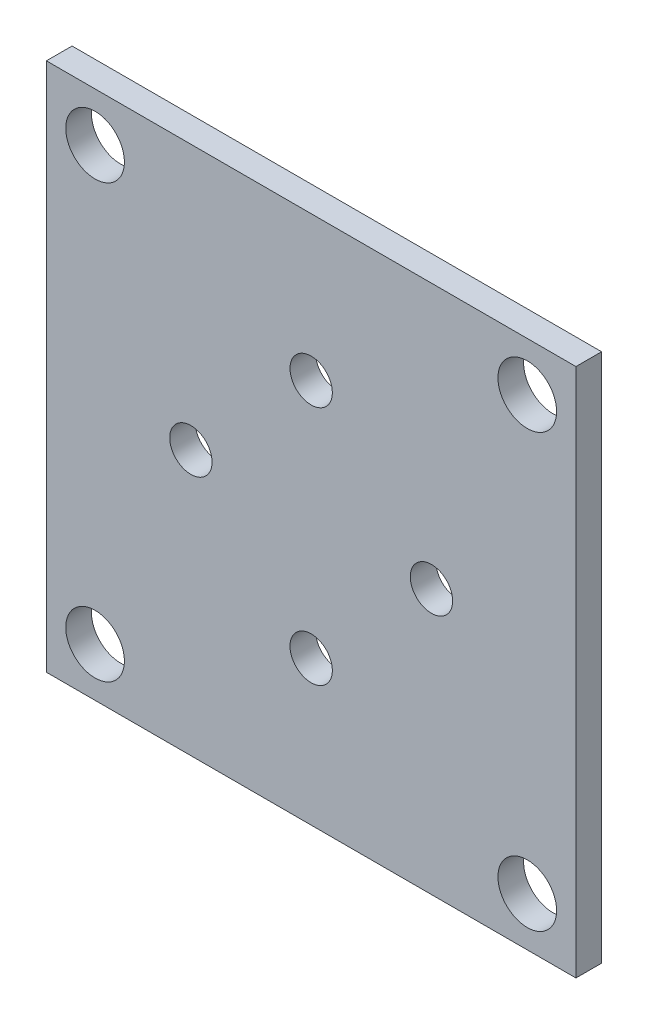
ISO-10303-21;
HEADER;
FILE_DESCRIPTION(('STEP AP214'),'2;1');
FILE_NAME('part.step','',(''),(''),'','','');
FILE_SCHEMA(('AUTOMOTIVE_DESIGN { 1 0 10303 214 1 1 1 1 }'));
ENDSEC;
DATA;
#1=APPLICATION_CONTEXT('core data for automotive mechanical design processes');
#2=APPLICATION_PROTOCOL_DEFINITION('international standard','automotive_design',2000,#1);
#3=PRODUCT_CONTEXT('',#1,'mechanical');
#4=PRODUCT('Part','Part','',(#3));
#5=PRODUCT_RELATED_PRODUCT_CATEGORY('part','',(#4));
#6=PRODUCT_DEFINITION_FORMATION('','',#4);
#7=PRODUCT_DEFINITION_CONTEXT('part definition',#1,'design');
#8=PRODUCT_DEFINITION('design','',#6,#7);
#9=PRODUCT_DEFINITION_SHAPE('','',#8);
#10=(LENGTH_UNIT() NAMED_UNIT(*) SI_UNIT(.MILLI.,.METRE.));
#11=(NAMED_UNIT(*) PLANE_ANGLE_UNIT() SI_UNIT($,.RADIAN.));
#12=(NAMED_UNIT(*) SI_UNIT($,.STERADIAN.) SOLID_ANGLE_UNIT());
#13=UNCERTAINTY_MEASURE_WITH_UNIT(LENGTH_MEASURE(1.E-05),#10,'distance_accuracy_value','');
#14=(GEOMETRIC_REPRESENTATION_CONTEXT(3) GLOBAL_UNCERTAINTY_ASSIGNED_CONTEXT((#13)) GLOBAL_UNIT_ASSIGNED_CONTEXT((#10,
#11,#12)) REPRESENTATION_CONTEXT('',''));
#15=CARTESIAN_POINT('',(0.,0.,0.));
#16=DIRECTION('',(0.,0.,1.));
#17=DIRECTION('',(1.,0.,0.));
#18=AXIS2_PLACEMENT_3D('',#15,#16,#17);
#19=CARTESIAN_POINT('',(16.51,-16.51,1.6002));
#20=DIRECTION('',(-1.,0.,0.));
#21=DIRECTION('',(0.,0.,1.));
#22=AXIS2_PLACEMENT_3D('',#19,#20,#21);
#23=PLANE('',#22);
#24=DIRECTION('',(0.,1.,0.));
#25=VECTOR('',#24,1.);
#26=CARTESIAN_POINT('',(16.51,-16.51,0.));
#27=LINE('',#26,#25);
#28=CARTESIAN_POINT('',(16.51,-16.51,0.));
#29=VERTEX_POINT('',#28);
#30=CARTESIAN_POINT('',(16.51,16.51,0.));
#31=VERTEX_POINT('',#30);
#32=EDGE_CURVE('E96',#29,#31,#27,.T.);
#33=ORIENTED_EDGE('',*,*,#32,.T.);
#34=DIRECTION('',(0.,0.,-1.));
#35=VECTOR('',#34,1.);
#36=CARTESIAN_POINT('',(16.51,16.51,1.6002));
#37=LINE('',#36,#35);
#38=CARTESIAN_POINT('',(16.51,16.51,1.6002));
#39=VERTEX_POINT('',#38);
#40=EDGE_CURVE('E11',#39,#31,#37,.T.);
#41=ORIENTED_EDGE('',*,*,#40,.F.);
#42=DIRECTION('',(0.,1.,0.));
#43=VECTOR('',#42,1.);
#44=CARTESIAN_POINT('',(16.51,-16.51,1.6002));
#45=LINE('',#44,#43);
#46=CARTESIAN_POINT('',(16.51,-16.51,1.6002));
#47=VERTEX_POINT('',#46);
#48=EDGE_CURVE('E84',#47,#39,#45,.T.);
#49=ORIENTED_EDGE('',*,*,#48,.F.);
#50=DIRECTION('',(0.,0.,-1.));
#51=VECTOR('',#50,1.);
#52=CARTESIAN_POINT('',(16.51,-16.51,1.6002));
#53=LINE('',#52,#51);
#54=EDGE_CURVE('E92',#47,#29,#53,.T.);
#55=ORIENTED_EDGE('',*,*,#54,.T.);
#56=EDGE_LOOP('',(#33,#41,#49,#55));
#57=FACE_BOUND('',#56,.T.);
#58=ADVANCED_FACE('F33',(#57),#23,.F.);
#59=CARTESIAN_POINT('',(-16.51,16.51,1.6002));
#60=DIRECTION('',(0.,-1.,0.));
#61=DIRECTION('',(0.,0.,-1.));
#62=AXIS2_PLACEMENT_3D('',#59,#60,#61);
#63=PLANE('',#62);
#64=DIRECTION('',(-1.,0.,0.));
#65=VECTOR('',#64,1.);
#66=CARTESIAN_POINT('',(-16.51,16.51,0.));
#67=LINE('',#66,#65);
#68=CARTESIAN_POINT('',(-16.51,16.51,0.));
#69=VERTEX_POINT('',#68);
#70=EDGE_CURVE('E88',#31,#69,#67,.T.);
#71=ORIENTED_EDGE('',*,*,#70,.T.);
#72=DIRECTION('',(0.,0.,-1.));
#73=VECTOR('',#72,1.);
#74=CARTESIAN_POINT('',(-16.51,16.51,1.6002));
#75=LINE('',#74,#73);
#76=CARTESIAN_POINT('',(-16.51,16.51,1.6002));
#77=VERTEX_POINT('',#76);
#78=EDGE_CURVE('E41',#77,#69,#75,.T.);
#79=ORIENTED_EDGE('',*,*,#78,.F.);
#80=DIRECTION('',(-1.,0.,0.));
#81=VECTOR('',#80,1.);
#82=CARTESIAN_POINT('',(-16.51,16.51,1.6002));
#83=LINE('',#82,#81);
#84=EDGE_CURVE('E79',#39,#77,#83,.T.);
#85=ORIENTED_EDGE('',*,*,#84,.F.);
#86=ORIENTED_EDGE('',*,*,#40,.T.);
#87=EDGE_LOOP('',(#71,#79,#85,#86));
#88=FACE_BOUND('',#87,.T.);
#89=ADVANCED_FACE('F87',(#88),#63,.F.);
#90=CARTESIAN_POINT('',(-16.51,-16.51,1.6002));
#91=DIRECTION('',(1.,0.,0.));
#92=DIRECTION('',(0.,0.,-1.));
#93=AXIS2_PLACEMENT_3D('',#90,#91,#92);
#94=PLANE('',#93);
#95=DIRECTION('',(0.,-1.,0.));
#96=VECTOR('',#95,1.);
#97=CARTESIAN_POINT('',(-16.51,-16.51,0.));
#98=LINE('',#97,#96);
#99=CARTESIAN_POINT('',(-16.51,-16.51,0.));
#100=VERTEX_POINT('',#99);
#101=EDGE_CURVE('E66',#69,#100,#98,.T.);
#102=ORIENTED_EDGE('',*,*,#101,.T.);
#103=DIRECTION('',(0.,0.,-1.));
#104=VECTOR('',#103,1.);
#105=CARTESIAN_POINT('',(-16.51,-16.51,1.6002));
#106=LINE('',#105,#104);
#107=CARTESIAN_POINT('',(-16.51,-16.51,1.6002));
#108=VERTEX_POINT('',#107);
#109=EDGE_CURVE('E89',#108,#100,#106,.T.);
#110=ORIENTED_EDGE('',*,*,#109,.F.);
#111=DIRECTION('',(0.,-1.,0.));
#112=VECTOR('',#111,1.);
#113=CARTESIAN_POINT('',(-16.51,-16.51,1.6002));
#114=LINE('',#113,#112);
#115=EDGE_CURVE('E82',#77,#108,#114,.T.);
#116=ORIENTED_EDGE('',*,*,#115,.F.);
#117=ORIENTED_EDGE('',*,*,#78,.T.);
#118=EDGE_LOOP('',(#102,#110,#116,#117));
#119=FACE_BOUND('',#118,.T.);
#120=ADVANCED_FACE('F90',(#119),#94,.F.);
#121=CARTESIAN_POINT('',(-16.51,-16.51,1.6002));
#122=DIRECTION('',(0.,1.,0.));
#123=DIRECTION('',(0.,0.,1.));
#124=AXIS2_PLACEMENT_3D('',#121,#122,#123);
#125=PLANE('',#124);
#126=DIRECTION('',(1.,0.,0.));
#127=VECTOR('',#126,1.);
#128=CARTESIAN_POINT('',(-16.51,-16.51,0.));
#129=LINE('',#128,#127);
#130=EDGE_CURVE('E72',#100,#29,#129,.T.);
#131=ORIENTED_EDGE('',*,*,#130,.T.);
#132=ORIENTED_EDGE('',*,*,#54,.F.);
#133=DIRECTION('',(1.,0.,0.));
#134=VECTOR('',#133,1.);
#135=CARTESIAN_POINT('',(-16.51,-16.51,1.6002));
#136=LINE('',#135,#134);
#137=EDGE_CURVE('E49',#108,#47,#136,.T.);
#138=ORIENTED_EDGE('',*,*,#137,.F.);
#139=ORIENTED_EDGE('',*,*,#109,.T.);
#140=EDGE_LOOP('',(#131,#132,#138,#139));
#141=FACE_BOUND('',#140,.T.);
#142=ADVANCED_FACE('F104',(#141),#125,.F.);
#143=CARTESIAN_POINT('',(0.,0.,1.6002));
#144=DIRECTION('',(0.,0.,-1.));
#145=DIRECTION('',(-1.,0.,0.));
#146=AXIS2_PLACEMENT_3D('',#143,#144,#145);
#147=PLANE('',#146);
#148=CARTESIAN_POINT('',(0.,7.5,1.6002));
#149=DIRECTION('',(0.,0.,1.));
#150=DIRECTION('',(1.,0.,0.));
#151=AXIS2_PLACEMENT_3D('',#148,#149,#150);
#152=CIRCLE('',#151,1.32079999999999);
#153=CARTESIAN_POINT('',(1.32079999999999,7.5,1.6002));
#154=VERTEX_POINT('',#153);
#155=EDGE_CURVE('E154',#154,#154,#152,.T.);
#156=ORIENTED_EDGE('',*,*,#155,.F.);
#157=EDGE_LOOP('',(#156));
#158=FACE_BOUND('',#157,.T.);
#159=CARTESIAN_POINT('',(7.5,0.,1.6002));
#160=DIRECTION('',(0.,0.,1.));
#161=DIRECTION('',(1.,0.,0.));
#162=AXIS2_PLACEMENT_3D('',#159,#160,#161);
#163=CIRCLE('',#162,1.32079999999999);
#164=CARTESIAN_POINT('',(8.82079999999999,0.,1.6002));
#165=VERTEX_POINT('',#164);
#166=EDGE_CURVE('E148',#165,#165,#163,.T.);
#167=ORIENTED_EDGE('',*,*,#166,.F.);
#168=EDGE_LOOP('',(#167));
#169=FACE_BOUND('',#168,.T.);
#170=CARTESIAN_POINT('',(0.,-7.5,1.6002));
#171=DIRECTION('',(0.,0.,1.));
#172=DIRECTION('',(1.,0.,0.));
#173=AXIS2_PLACEMENT_3D('',#170,#171,#172);
#174=CIRCLE('',#173,1.32079999999999);
#175=CARTESIAN_POINT('',(1.32079999999999,-7.5,1.6002));
#176=VERTEX_POINT('',#175);
#177=EDGE_CURVE('E142',#176,#176,#174,.T.);
#178=ORIENTED_EDGE('',*,*,#177,.F.);
#179=EDGE_LOOP('',(#178));
#180=FACE_BOUND('',#179,.T.);
#181=CARTESIAN_POINT('',(-7.5,0.,1.6002));
#182=DIRECTION('',(0.,0.,1.));
#183=DIRECTION('',(1.,0.,0.));
#184=AXIS2_PLACEMENT_3D('',#181,#182,#183);
#185=CIRCLE('',#184,1.32079999999999);
#186=CARTESIAN_POINT('',(-6.17920000000001,0.,1.6002));
#187=VERTEX_POINT('',#186);
#188=EDGE_CURVE('E136',#187,#187,#185,.T.);
#189=ORIENTED_EDGE('',*,*,#188,.F.);
#190=EDGE_LOOP('',(#189));
#191=FACE_BOUND('',#190,.T.);
#192=CARTESIAN_POINT('',(-13.4747,13.4747,1.6002));
#193=DIRECTION('',(0.,0.,1.));
#194=DIRECTION('',(1.,0.,0.));
#195=AXIS2_PLACEMENT_3D('',#192,#193,#194);
#196=CIRCLE('',#195,1.82879999999999);
#197=CARTESIAN_POINT('',(-11.6459,13.4747,1.6002));
#198=VERTEX_POINT('',#197);
#199=EDGE_CURVE('E130',#198,#198,#196,.T.);
#200=ORIENTED_EDGE('',*,*,#199,.F.);
#201=EDGE_LOOP('',(#200));
#202=FACE_BOUND('',#201,.T.);
#203=CARTESIAN_POINT('',(13.4747,13.4747,1.6002));
#204=DIRECTION('',(0.,0.,1.));
#205=DIRECTION('',(1.,0.,0.));
#206=AXIS2_PLACEMENT_3D('',#203,#204,#205);
#207=CIRCLE('',#206,1.82879999999999);
#208=CARTESIAN_POINT('',(15.3035,13.4747,1.6002));
#209=VERTEX_POINT('',#208);
#210=EDGE_CURVE('E124',#209,#209,#207,.T.);
#211=ORIENTED_EDGE('',*,*,#210,.F.);
#212=EDGE_LOOP('',(#211));
#213=FACE_BOUND('',#212,.T.);
#214=CARTESIAN_POINT('',(13.4747,-13.4747,1.6002));
#215=DIRECTION('',(0.,0.,1.));
#216=DIRECTION('',(1.,0.,0.));
#217=AXIS2_PLACEMENT_3D('',#214,#215,#216);
#218=CIRCLE('',#217,1.82879999999999);
#219=CARTESIAN_POINT('',(15.3035,-13.4747,1.6002));
#220=VERTEX_POINT('',#219);
#221=EDGE_CURVE('E118',#220,#220,#218,.T.);
#222=ORIENTED_EDGE('',*,*,#221,.F.);
#223=EDGE_LOOP('',(#222));
#224=FACE_BOUND('',#223,.T.);
#225=CARTESIAN_POINT('',(-13.4747,-13.4747,1.6002));
#226=DIRECTION('',(0.,0.,1.));
#227=DIRECTION('',(1.,0.,0.));
#228=AXIS2_PLACEMENT_3D('',#225,#226,#227);
#229=CIRCLE('',#228,1.82879999999999);
#230=CARTESIAN_POINT('',(-11.6459,-13.4747,1.6002));
#231=VERTEX_POINT('',#230);
#232=EDGE_CURVE('E112',#231,#231,#229,.T.);
#233=ORIENTED_EDGE('',*,*,#232,.F.);
#234=EDGE_LOOP('',(#233));
#235=FACE_BOUND('',#234,.T.);
#236=ORIENTED_EDGE('',*,*,#48,.T.);
#237=ORIENTED_EDGE('',*,*,#84,.T.);
#238=ORIENTED_EDGE('',*,*,#115,.T.);
#239=ORIENTED_EDGE('',*,*,#137,.T.);
#240=EDGE_LOOP('',(#236,#237,#238,#239));
#241=FACE_BOUND('',#240,.T.);
#242=ADVANCED_FACE('F80',(#158,#169,#180,#191,#202,#213,#224,#235,#241),#147,.F.);
#243=CARTESIAN_POINT('',(0.,0.,0.));
#244=DIRECTION('',(0.,0.,-1.));
#245=DIRECTION('',(-1.,0.,0.));
#246=AXIS2_PLACEMENT_3D('',#243,#244,#245);
#247=PLANE('',#246);
#248=CARTESIAN_POINT('',(0.,7.5,0.));
#249=DIRECTION('',(0.,0.,1.));
#250=DIRECTION('',(1.,0.,0.));
#251=AXIS2_PLACEMENT_3D('',#248,#249,#250);
#252=CIRCLE('',#251,1.32079999999999);
#253=CARTESIAN_POINT('',(1.32079999999999,7.5,0.));
#254=VERTEX_POINT('',#253);
#255=EDGE_CURVE('E151',#254,#254,#252,.T.);
#256=ORIENTED_EDGE('',*,*,#255,.T.);
#257=EDGE_LOOP('',(#256));
#258=FACE_BOUND('',#257,.T.);
#259=CARTESIAN_POINT('',(7.5,0.,0.));
#260=DIRECTION('',(0.,0.,1.));
#261=DIRECTION('',(1.,0.,0.));
#262=AXIS2_PLACEMENT_3D('',#259,#260,#261);
#263=CIRCLE('',#262,1.32079999999999);
#264=CARTESIAN_POINT('',(8.82079999999999,0.,0.));
#265=VERTEX_POINT('',#264);
#266=EDGE_CURVE('E145',#265,#265,#263,.T.);
#267=ORIENTED_EDGE('',*,*,#266,.T.);
#268=EDGE_LOOP('',(#267));
#269=FACE_BOUND('',#268,.T.);
#270=CARTESIAN_POINT('',(0.,-7.5,0.));
#271=DIRECTION('',(0.,0.,1.));
#272=DIRECTION('',(1.,0.,0.));
#273=AXIS2_PLACEMENT_3D('',#270,#271,#272);
#274=CIRCLE('',#273,1.32079999999999);
#275=CARTESIAN_POINT('',(1.32079999999999,-7.5,0.));
#276=VERTEX_POINT('',#275);
#277=EDGE_CURVE('E139',#276,#276,#274,.T.);
#278=ORIENTED_EDGE('',*,*,#277,.T.);
#279=EDGE_LOOP('',(#278));
#280=FACE_BOUND('',#279,.T.);
#281=CARTESIAN_POINT('',(-7.5,0.,0.));
#282=DIRECTION('',(0.,0.,1.));
#283=DIRECTION('',(1.,0.,0.));
#284=AXIS2_PLACEMENT_3D('',#281,#282,#283);
#285=CIRCLE('',#284,1.32079999999999);
#286=CARTESIAN_POINT('',(-6.17920000000001,0.,0.));
#287=VERTEX_POINT('',#286);
#288=EDGE_CURVE('E133',#287,#287,#285,.T.);
#289=ORIENTED_EDGE('',*,*,#288,.T.);
#290=EDGE_LOOP('',(#289));
#291=FACE_BOUND('',#290,.T.);
#292=CARTESIAN_POINT('',(-13.4747,13.4747,0.));
#293=DIRECTION('',(0.,0.,1.));
#294=DIRECTION('',(1.,0.,0.));
#295=AXIS2_PLACEMENT_3D('',#292,#293,#294);
#296=CIRCLE('',#295,1.82879999999999);
#297=CARTESIAN_POINT('',(-11.6459,13.4747,0.));
#298=VERTEX_POINT('',#297);
#299=EDGE_CURVE('E127',#298,#298,#296,.T.);
#300=ORIENTED_EDGE('',*,*,#299,.T.);
#301=EDGE_LOOP('',(#300));
#302=FACE_BOUND('',#301,.T.);
#303=CARTESIAN_POINT('',(13.4747,13.4747,0.));
#304=DIRECTION('',(0.,0.,1.));
#305=DIRECTION('',(1.,0.,0.));
#306=AXIS2_PLACEMENT_3D('',#303,#304,#305);
#307=CIRCLE('',#306,1.82879999999999);
#308=CARTESIAN_POINT('',(15.3035,13.4747,0.));
#309=VERTEX_POINT('',#308);
#310=EDGE_CURVE('E121',#309,#309,#307,.T.);
#311=ORIENTED_EDGE('',*,*,#310,.T.);
#312=EDGE_LOOP('',(#311));
#313=FACE_BOUND('',#312,.T.);
#314=CARTESIAN_POINT('',(13.4747,-13.4747,0.));
#315=DIRECTION('',(0.,0.,1.));
#316=DIRECTION('',(1.,0.,0.));
#317=AXIS2_PLACEMENT_3D('',#314,#315,#316);
#318=CIRCLE('',#317,1.82879999999999);
#319=CARTESIAN_POINT('',(15.3035,-13.4747,0.));
#320=VERTEX_POINT('',#319);
#321=EDGE_CURVE('E115',#320,#320,#318,.T.);
#322=ORIENTED_EDGE('',*,*,#321,.T.);
#323=EDGE_LOOP('',(#322));
#324=FACE_BOUND('',#323,.T.);
#325=CARTESIAN_POINT('',(-13.4747,-13.4747,0.));
#326=DIRECTION('',(0.,0.,1.));
#327=DIRECTION('',(1.,0.,0.));
#328=AXIS2_PLACEMENT_3D('',#325,#326,#327);
#329=CIRCLE('',#328,1.82879999999999);
#330=CARTESIAN_POINT('',(-11.6459,-13.4747,0.));
#331=VERTEX_POINT('',#330);
#332=EDGE_CURVE('E99',#331,#331,#329,.T.);
#333=ORIENTED_EDGE('',*,*,#332,.T.);
#334=EDGE_LOOP('',(#333));
#335=FACE_BOUND('',#334,.T.);
#336=ORIENTED_EDGE('',*,*,#32,.F.);
#337=ORIENTED_EDGE('',*,*,#130,.F.);
#338=ORIENTED_EDGE('',*,*,#101,.F.);
#339=ORIENTED_EDGE('',*,*,#70,.F.);
#340=EDGE_LOOP('',(#336,#337,#338,#339));
#341=FACE_BOUND('',#340,.T.);
#342=ADVANCED_FACE('F107',(#258,#269,#280,#291,#302,#313,#324,#335,#341),#247,.T.);
#343=CARTESIAN_POINT('',(-13.4747,-13.4747,1.6002));
#344=DIRECTION('',(0.,0.,1.));
#345=DIRECTION('',(1.,0.,0.));
#346=AXIS2_PLACEMENT_3D('',#343,#344,#345);
#347=CYLINDRICAL_SURFACE('',#346,1.82879999999999);
#348=ORIENTED_EDGE('',*,*,#332,.F.);
#349=EDGE_LOOP('',(#348));
#350=FACE_BOUND('',#349,.T.);
#351=ORIENTED_EDGE('',*,*,#232,.T.);
#352=EDGE_LOOP('',(#351));
#353=FACE_BOUND('',#352,.T.);
#354=ADVANCED_FACE('F177',(#350,#353),#347,.F.);
#355=CARTESIAN_POINT('',(13.4747,-13.4747,1.6002));
#356=DIRECTION('',(0.,0.,1.));
#357=DIRECTION('',(1.,0.,0.));
#358=AXIS2_PLACEMENT_3D('',#355,#356,#357);
#359=CYLINDRICAL_SURFACE('',#358,1.82879999999999);
#360=ORIENTED_EDGE('',*,*,#321,.F.);
#361=EDGE_LOOP('',(#360));
#362=FACE_BOUND('',#361,.T.);
#363=ORIENTED_EDGE('',*,*,#221,.T.);
#364=EDGE_LOOP('',(#363));
#365=FACE_BOUND('',#364,.T.);
#366=ADVANCED_FACE('F179',(#362,#365),#359,.F.);
#367=CARTESIAN_POINT('',(13.4747,13.4747,1.6002));
#368=DIRECTION('',(0.,0.,1.));
#369=DIRECTION('',(1.,0.,0.));
#370=AXIS2_PLACEMENT_3D('',#367,#368,#369);
#371=CYLINDRICAL_SURFACE('',#370,1.82879999999999);
#372=ORIENTED_EDGE('',*,*,#310,.F.);
#373=EDGE_LOOP('',(#372));
#374=FACE_BOUND('',#373,.T.);
#375=ORIENTED_EDGE('',*,*,#210,.T.);
#376=EDGE_LOOP('',(#375));
#377=FACE_BOUND('',#376,.T.);
#378=ADVANCED_FACE('F186',(#374,#377),#371,.F.);
#379=CARTESIAN_POINT('',(-13.4747,13.4747,1.6002));
#380=DIRECTION('',(0.,0.,1.));
#381=DIRECTION('',(1.,0.,0.));
#382=AXIS2_PLACEMENT_3D('',#379,#380,#381);
#383=CYLINDRICAL_SURFACE('',#382,1.82879999999999);
#384=ORIENTED_EDGE('',*,*,#299,.F.);
#385=EDGE_LOOP('',(#384));
#386=FACE_BOUND('',#385,.T.);
#387=ORIENTED_EDGE('',*,*,#199,.T.);
#388=EDGE_LOOP('',(#387));
#389=FACE_BOUND('',#388,.T.);
#390=ADVANCED_FACE('F227',(#386,#389),#383,.F.);
#391=CARTESIAN_POINT('',(-7.5,0.,1.6002));
#392=DIRECTION('',(0.,0.,1.));
#393=DIRECTION('',(1.,0.,0.));
#394=AXIS2_PLACEMENT_3D('',#391,#392,#393);
#395=CYLINDRICAL_SURFACE('',#394,1.32079999999999);
#396=ORIENTED_EDGE('',*,*,#288,.F.);
#397=EDGE_LOOP('',(#396));
#398=FACE_BOUND('',#397,.T.);
#399=ORIENTED_EDGE('',*,*,#188,.T.);
#400=EDGE_LOOP('',(#399));
#401=FACE_BOUND('',#400,.T.);
#402=ADVANCED_FACE('F221',(#398,#401),#395,.F.);
#403=CARTESIAN_POINT('',(0.,-7.5,1.6002));
#404=DIRECTION('',(0.,0.,1.));
#405=DIRECTION('',(1.,0.,0.));
#406=AXIS2_PLACEMENT_3D('',#403,#404,#405);
#407=CYLINDRICAL_SURFACE('',#406,1.32079999999999);
#408=ORIENTED_EDGE('',*,*,#277,.F.);
#409=EDGE_LOOP('',(#408));
#410=FACE_BOUND('',#409,.T.);
#411=ORIENTED_EDGE('',*,*,#177,.T.);
#412=EDGE_LOOP('',(#411));
#413=FACE_BOUND('',#412,.T.);
#414=ADVANCED_FACE('F226',(#410,#413),#407,.F.);
#415=CARTESIAN_POINT('',(7.5,0.,1.6002));
#416=DIRECTION('',(0.,0.,1.));
#417=DIRECTION('',(1.,0.,0.));
#418=AXIS2_PLACEMENT_3D('',#415,#416,#417);
#419=CYLINDRICAL_SURFACE('',#418,1.32079999999999);
#420=ORIENTED_EDGE('',*,*,#266,.F.);
#421=EDGE_LOOP('',(#420));
#422=FACE_BOUND('',#421,.T.);
#423=ORIENTED_EDGE('',*,*,#166,.T.);
#424=EDGE_LOOP('',(#423));
#425=FACE_BOUND('',#424,.T.);
#426=ADVANCED_FACE('F239',(#422,#425),#419,.F.);
#427=CARTESIAN_POINT('',(0.,7.5,1.6002));
#428=DIRECTION('',(0.,0.,1.));
#429=DIRECTION('',(1.,0.,0.));
#430=AXIS2_PLACEMENT_3D('',#427,#428,#429);
#431=CYLINDRICAL_SURFACE('',#430,1.32079999999999);
#432=ORIENTED_EDGE('',*,*,#255,.F.);
#433=EDGE_LOOP('',(#432));
#434=FACE_BOUND('',#433,.T.);
#435=ORIENTED_EDGE('',*,*,#155,.T.);
#436=EDGE_LOOP('',(#435));
#437=FACE_BOUND('',#436,.T.);
#438=ADVANCED_FACE('F158',(#434,#437),#431,.F.);
#439=CLOSED_SHELL('',(#58,#89,#120,#142,#242,#342,#354,#366,#378,#390,#402,#414,#426,#438));
#440=MANIFOLD_SOLID_BREP('B2',#439);
#441=ADVANCED_BREP_SHAPE_REPRESENTATION('',(#18,#440),#14);
#442=SHAPE_DEFINITION_REPRESENTATION(#9,#441);
ENDSEC;
END-ISO-10303-21;
